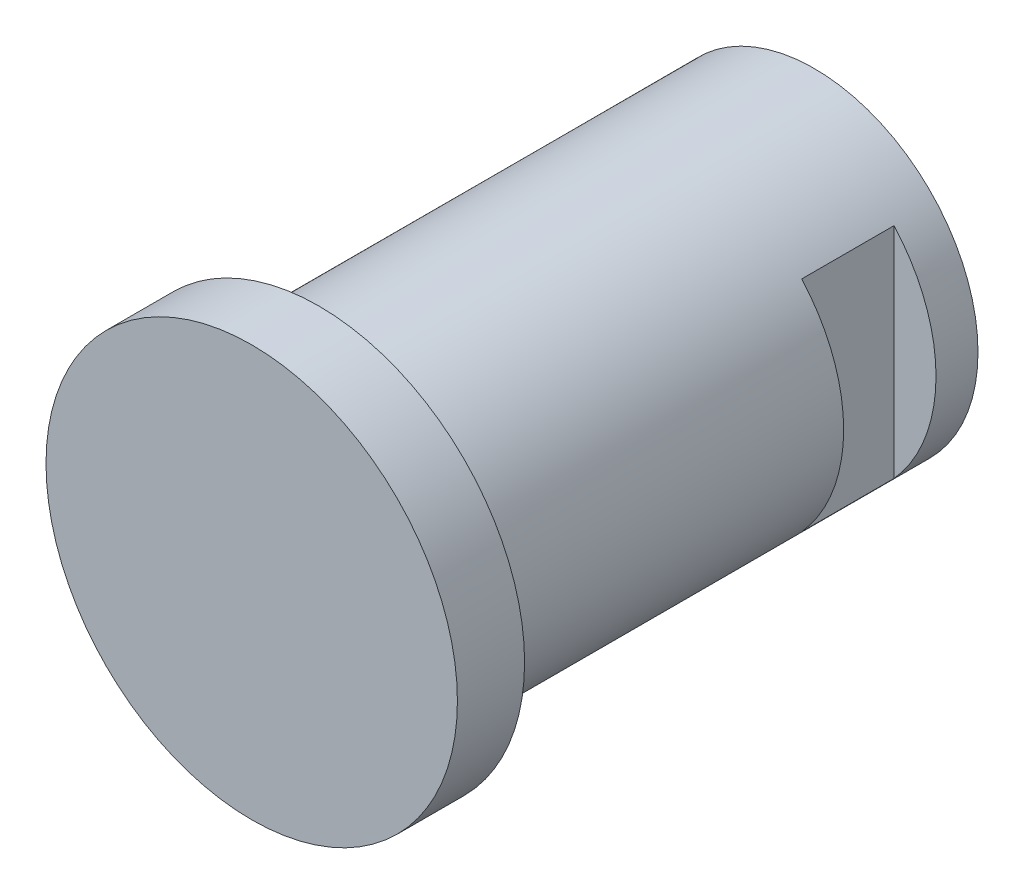
ISO-10303-21;
HEADER;
FILE_DESCRIPTION(('STEP AP214'),'2;1');
FILE_NAME('part.step','',(''),(''),'','','');
FILE_SCHEMA(('AUTOMOTIVE_DESIGN { 1 0 10303 214 1 1 1 1 }'));
ENDSEC;
DATA;
#1=APPLICATION_CONTEXT('core data for automotive mechanical design processes');
#2=APPLICATION_PROTOCOL_DEFINITION('international standard','automotive_design',2000,#1);
#3=PRODUCT_CONTEXT('',#1,'mechanical');
#4=PRODUCT('Part','Part','',(#3));
#5=PRODUCT_RELATED_PRODUCT_CATEGORY('part','',(#4));
#6=PRODUCT_DEFINITION_FORMATION('','',#4);
#7=PRODUCT_DEFINITION_CONTEXT('part definition',#1,'design');
#8=PRODUCT_DEFINITION('design','',#6,#7);
#9=PRODUCT_DEFINITION_SHAPE('','',#8);
#10=(LENGTH_UNIT() NAMED_UNIT(*) SI_UNIT(.MILLI.,.METRE.));
#11=(NAMED_UNIT(*) PLANE_ANGLE_UNIT() SI_UNIT($,.RADIAN.));
#12=(NAMED_UNIT(*) SI_UNIT($,.STERADIAN.) SOLID_ANGLE_UNIT());
#13=UNCERTAINTY_MEASURE_WITH_UNIT(LENGTH_MEASURE(1.E-05),#10,'distance_accuracy_value','');
#14=(GEOMETRIC_REPRESENTATION_CONTEXT(3) GLOBAL_UNCERTAINTY_ASSIGNED_CONTEXT((#13)) GLOBAL_UNIT_ASSIGNED_CONTEXT((#10,
#11,#12)) REPRESENTATION_CONTEXT('',''));
#15=CARTESIAN_POINT('',(0.,0.,0.));
#16=DIRECTION('',(0.,0.,1.));
#17=DIRECTION('',(1.,0.,0.));
#18=AXIS2_PLACEMENT_3D('',#15,#16,#17);
#19=CARTESIAN_POINT('',(0.,0.,17.018));
#20=DIRECTION('',(0.,0.,-1.));
#21=DIRECTION('',(-1.,0.,0.));
#22=AXIS2_PLACEMENT_3D('',#19,#20,#21);
#23=CYLINDRICAL_SURFACE('',#22,4.953);
#24=CARTESIAN_POINT('',(0.,0.,4.064));
#25=DIRECTION('',(0.,0.,1.));
#26=DIRECTION('',(1.,0.,0.));
#27=AXIS2_PLACEMENT_3D('',#24,#25,#26);
#28=CIRCLE('',#27,4.953);
#29=CARTESIAN_POINT('',(3.683,-3.31175482184294,4.064));
#30=VERTEX_POINT('',#29);
#31=CARTESIAN_POINT('',(3.683,3.31175482184294,4.064));
#32=VERTEX_POINT('',#31);
#33=EDGE_CURVE('E121',#30,#32,#28,.T.);
#34=ORIENTED_EDGE('',*,*,#33,.T.);
#35=DIRECTION('',(0.,0.,-1.));
#36=VECTOR('',#35,1.);
#37=CARTESIAN_POINT('',(3.683,3.31175482184294,17.018));
#38=LINE('',#37,#36);
#39=CARTESIAN_POINT('',(3.683,3.31175482184294,1.27));
#40=VERTEX_POINT('',#39);
#41=EDGE_CURVE('E11',#32,#40,#38,.T.);
#42=ORIENTED_EDGE('',*,*,#41,.T.);
#43=CARTESIAN_POINT('',(0.,0.,1.27));
#44=DIRECTION('',(0.,0.,1.));
#45=DIRECTION('',(1.,0.,0.));
#46=AXIS2_PLACEMENT_3D('',#43,#44,#45);
#47=CIRCLE('',#46,4.953);
#48=CARTESIAN_POINT('',(3.683,-3.31175482184294,1.27));
#49=VERTEX_POINT('',#48);
#50=EDGE_CURVE('E53',#49,#40,#47,.T.);
#51=ORIENTED_EDGE('',*,*,#50,.F.);
#52=DIRECTION('',(0.,0.,-1.));
#53=VECTOR('',#52,1.);
#54=CARTESIAN_POINT('',(3.683,-3.31175482184294,17.018));
#55=LINE('',#54,#53);
#56=EDGE_CURVE('E117',#49,#30,#55,.F.);
#57=ORIENTED_EDGE('',*,*,#56,.T.);
#58=EDGE_LOOP('',(#34,#42,#51,#57));
#59=FACE_BOUND('',#58,.T.);
#60=DIRECTION('',(0.,0.,-1.));
#61=VECTOR('',#60,1.);
#62=CARTESIAN_POINT('',(-3.683,3.31175482184295,17.018));
#63=LINE('',#62,#61);
#64=CARTESIAN_POINT('',(-3.683,3.31175482184295,4.064));
#65=VERTEX_POINT('',#64);
#66=CARTESIAN_POINT('',(-3.683,3.31175482184295,1.27));
#67=VERTEX_POINT('',#66);
#68=EDGE_CURVE('E102',#65,#67,#63,.T.);
#69=ORIENTED_EDGE('',*,*,#68,.F.);
#70=CARTESIAN_POINT('',(0.,0.,4.064));
#71=DIRECTION('',(0.,0.,1.));
#72=DIRECTION('',(1.,0.,0.));
#73=AXIS2_PLACEMENT_3D('',#70,#71,#72);
#74=CIRCLE('',#73,4.953);
#75=CARTESIAN_POINT('',(-3.683,-3.31175482184295,4.064));
#76=VERTEX_POINT('',#75);
#77=EDGE_CURVE('E108',#65,#76,#74,.T.);
#78=ORIENTED_EDGE('',*,*,#77,.T.);
#79=DIRECTION('',(0.,0.,-1.));
#80=VECTOR('',#79,1.);
#81=CARTESIAN_POINT('',(-3.683,-3.31175482184295,17.018));
#82=LINE('',#81,#80);
#83=CARTESIAN_POINT('',(-3.683,-3.31175482184295,1.27));
#84=VERTEX_POINT('',#83);
#85=EDGE_CURVE('E95',#84,#76,#82,.F.);
#86=ORIENTED_EDGE('',*,*,#85,.F.);
#87=CARTESIAN_POINT('',(0.,0.,1.27));
#88=DIRECTION('',(0.,0.,1.));
#89=DIRECTION('',(1.,0.,0.));
#90=AXIS2_PLACEMENT_3D('',#87,#88,#89);
#91=CIRCLE('',#90,4.953);
#92=EDGE_CURVE('E86',#67,#84,#91,.T.);
#93=ORIENTED_EDGE('',*,*,#92,.F.);
#94=EDGE_LOOP('',(#69,#78,#86,#93));
#95=FACE_BOUND('',#94,.T.);
#96=CARTESIAN_POINT('',(0.,0.,0.));
#97=DIRECTION('',(0.,0.,1.));
#98=DIRECTION('',(1.,0.,0.));
#99=AXIS2_PLACEMENT_3D('',#96,#97,#98);
#100=CIRCLE('',#99,4.953);
#101=CARTESIAN_POINT('',(4.953,0.,0.));
#102=VERTEX_POINT('',#101);
#103=EDGE_CURVE('E143',#102,#102,#100,.T.);
#104=ORIENTED_EDGE('',*,*,#103,.T.);
#105=EDGE_LOOP('',(#104));
#106=FACE_BOUND('',#105,.T.);
#107=CARTESIAN_POINT('',(0.,0.,14.986));
#108=DIRECTION('',(0.,0.,1.));
#109=DIRECTION('',(1.,0.,0.));
#110=AXIS2_PLACEMENT_3D('',#107,#108,#109);
#111=CIRCLE('',#110,4.953);
#112=CARTESIAN_POINT('',(4.953,0.,14.986));
#113=VERTEX_POINT('',#112);
#114=EDGE_CURVE('E96',#113,#113,#111,.T.);
#115=ORIENTED_EDGE('',*,*,#114,.F.);
#116=EDGE_LOOP('',(#115));
#117=FACE_BOUND('',#116,.T.);
#118=ADVANCED_FACE('F45',(#59,#95,#106,#117),#23,.T.);
#119=CARTESIAN_POINT('',(0.,0.,0.));
#120=DIRECTION('',(0.,0.,1.));
#121=DIRECTION('',(1.,0.,0.));
#122=AXIS2_PLACEMENT_3D('',#119,#120,#121);
#123=PLANE('',#122);
#124=ORIENTED_EDGE('',*,*,#103,.F.);
#125=EDGE_LOOP('',(#124));
#126=FACE_BOUND('',#125,.T.);
#127=ADVANCED_FACE('F155',(#126),#123,.F.);
#128=CARTESIAN_POINT('',(0.,0.,14.986));
#129=DIRECTION('',(0.,0.,1.));
#130=DIRECTION('',(1.,0.,0.));
#131=AXIS2_PLACEMENT_3D('',#128,#129,#130);
#132=CYLINDRICAL_SURFACE('',#131,6.223);
#133=CARTESIAN_POINT('',(0.,0.,14.986));
#134=DIRECTION('',(0.,0.,1.));
#135=DIRECTION('',(1.,0.,0.));
#136=AXIS2_PLACEMENT_3D('',#133,#134,#135);
#137=CIRCLE('',#136,6.223);
#138=CARTESIAN_POINT('',(6.223,0.,14.986));
#139=VERTEX_POINT('',#138);
#140=EDGE_CURVE('E135',#139,#139,#137,.T.);
#141=ORIENTED_EDGE('',*,*,#140,.T.);
#142=EDGE_LOOP('',(#141));
#143=FACE_BOUND('',#142,.T.);
#144=CARTESIAN_POINT('',(0.,0.,17.018));
#145=DIRECTION('',(0.,0.,1.));
#146=DIRECTION('',(1.,0.,0.));
#147=AXIS2_PLACEMENT_3D('',#144,#145,#146);
#148=CIRCLE('',#147,6.223);
#149=CARTESIAN_POINT('',(6.223,0.,17.018));
#150=VERTEX_POINT('',#149);
#151=EDGE_CURVE('E130',#150,#150,#148,.T.);
#152=ORIENTED_EDGE('',*,*,#151,.F.);
#153=EDGE_LOOP('',(#152));
#154=FACE_BOUND('',#153,.T.);
#155=ADVANCED_FACE('F161',(#143,#154),#132,.T.);
#156=CARTESIAN_POINT('',(0.,0.,14.986));
#157=DIRECTION('',(0.,0.,1.));
#158=DIRECTION('',(1.,0.,0.));
#159=AXIS2_PLACEMENT_3D('',#156,#157,#158);
#160=PLANE('',#159);
#161=ORIENTED_EDGE('',*,*,#114,.T.);
#162=EDGE_LOOP('',(#161));
#163=FACE_BOUND('',#162,.T.);
#164=ORIENTED_EDGE('',*,*,#140,.F.);
#165=EDGE_LOOP('',(#164));
#166=FACE_BOUND('',#165,.T.);
#167=ADVANCED_FACE('F151',(#163,#166),#160,.F.);
#168=CARTESIAN_POINT('',(0.,0.,17.018));
#169=DIRECTION('',(0.,0.,1.));
#170=DIRECTION('',(1.,0.,0.));
#171=AXIS2_PLACEMENT_3D('',#168,#169,#170);
#172=PLANE('',#171);
#173=ORIENTED_EDGE('',*,*,#151,.T.);
#174=EDGE_LOOP('',(#173));
#175=FACE_BOUND('',#174,.T.);
#176=ADVANCED_FACE('F170',(#175),#172,.T.);
#177=CARTESIAN_POINT('',(-3.683,-6.223,0.));
#178=DIRECTION('',(-1.,0.,0.));
#179=DIRECTION('',(0.,0.,1.));
#180=AXIS2_PLACEMENT_3D('',#177,#178,#179);
#181=PLANE('',#180);
#182=ORIENTED_EDGE('',*,*,#68,.T.);
#183=DIRECTION('',(0.,1.,0.));
#184=VECTOR('',#183,1.);
#185=CARTESIAN_POINT('',(-3.683,-6.223,1.27));
#186=LINE('',#185,#184);
#187=EDGE_CURVE('E89',#84,#67,#186,.T.);
#188=ORIENTED_EDGE('',*,*,#187,.F.);
#189=ORIENTED_EDGE('',*,*,#85,.T.);
#190=DIRECTION('',(0.,1.,0.));
#191=VECTOR('',#190,1.);
#192=CARTESIAN_POINT('',(-3.683,-6.223,4.064));
#193=LINE('',#192,#191);
#194=EDGE_CURVE('E104',#76,#65,#193,.T.);
#195=ORIENTED_EDGE('',*,*,#194,.T.);
#196=EDGE_LOOP('',(#182,#188,#189,#195));
#197=FACE_BOUND('',#196,.T.);
#198=ADVANCED_FACE('F99',(#197),#181,.T.);
#199=CARTESIAN_POINT('',(0.,-6.223,4.064));
#200=DIRECTION('',(0.,0.,1.));
#201=DIRECTION('',(1.,0.,0.));
#202=AXIS2_PLACEMENT_3D('',#199,#200,#201);
#203=PLANE('',#202);
#204=ORIENTED_EDGE('',*,*,#194,.F.);
#205=ORIENTED_EDGE('',*,*,#77,.F.);
#206=EDGE_LOOP('',(#204,#205));
#207=FACE_BOUND('',#206,.T.);
#208=ADVANCED_FACE('F176',(#207),#203,.F.);
#209=CARTESIAN_POINT('',(0.,-6.223,1.27));
#210=DIRECTION('',(0.,0.,1.));
#211=DIRECTION('',(1.,0.,0.));
#212=AXIS2_PLACEMENT_3D('',#209,#210,#211);
#213=PLANE('',#212);
#214=ORIENTED_EDGE('',*,*,#187,.T.);
#215=ORIENTED_EDGE('',*,*,#92,.T.);
#216=EDGE_LOOP('',(#214,#215));
#217=FACE_BOUND('',#216,.T.);
#218=ADVANCED_FACE('F88',(#217),#213,.T.);
#219=CARTESIAN_POINT('',(0.,-6.223,1.27));
#220=DIRECTION('',(0.,0.,1.));
#221=DIRECTION('',(1.,0.,0.));
#222=AXIS2_PLACEMENT_3D('',#219,#220,#221);
#223=PLANE('',#222);
#224=ORIENTED_EDGE('',*,*,#50,.T.);
#225=DIRECTION('',(0.,1.,0.));
#226=VECTOR('',#225,1.);
#227=CARTESIAN_POINT('',(3.683,-6.223,1.27));
#228=LINE('',#227,#226);
#229=EDGE_CURVE('E127',#49,#40,#228,.T.);
#230=ORIENTED_EDGE('',*,*,#229,.F.);
#231=EDGE_LOOP('',(#224,#230));
#232=FACE_BOUND('',#231,.T.);
#233=ADVANCED_FACE('F179',(#232),#223,.T.);
#234=CARTESIAN_POINT('',(0.,-6.223,4.064));
#235=DIRECTION('',(0.,0.,1.));
#236=DIRECTION('',(1.,0.,0.));
#237=AXIS2_PLACEMENT_3D('',#234,#235,#236);
#238=PLANE('',#237);
#239=ORIENTED_EDGE('',*,*,#33,.F.);
#240=DIRECTION('',(0.,1.,0.));
#241=VECTOR('',#240,1.);
#242=CARTESIAN_POINT('',(3.683,-6.223,4.064));
#243=LINE('',#242,#241);
#244=EDGE_CURVE('E60',#30,#32,#243,.T.);
#245=ORIENTED_EDGE('',*,*,#244,.T.);
#246=EDGE_LOOP('',(#239,#245));
#247=FACE_BOUND('',#246,.T.);
#248=ADVANCED_FACE('F128',(#247),#238,.F.);
#249=CARTESIAN_POINT('',(3.683,-6.223,0.));
#250=DIRECTION('',(-1.,0.,0.));
#251=DIRECTION('',(0.,0.,1.));
#252=AXIS2_PLACEMENT_3D('',#249,#250,#251);
#253=PLANE('',#252);
#254=ORIENTED_EDGE('',*,*,#244,.F.);
#255=ORIENTED_EDGE('',*,*,#56,.F.);
#256=ORIENTED_EDGE('',*,*,#229,.T.);
#257=ORIENTED_EDGE('',*,*,#41,.F.);
#258=EDGE_LOOP('',(#254,#255,#256,#257));
#259=FACE_BOUND('',#258,.T.);
#260=ADVANCED_FACE('F126',(#259),#253,.F.);
#261=CLOSED_SHELL('',(#118,#127,#155,#167,#176,#198,#208,#218,#233,#248,#260));
#262=MANIFOLD_SOLID_BREP('B2',#261);
#263=ADVANCED_BREP_SHAPE_REPRESENTATION('',(#18,#262),#14);
#264=SHAPE_DEFINITION_REPRESENTATION(#9,#263);
ENDSEC;
END-ISO-10303-21;
